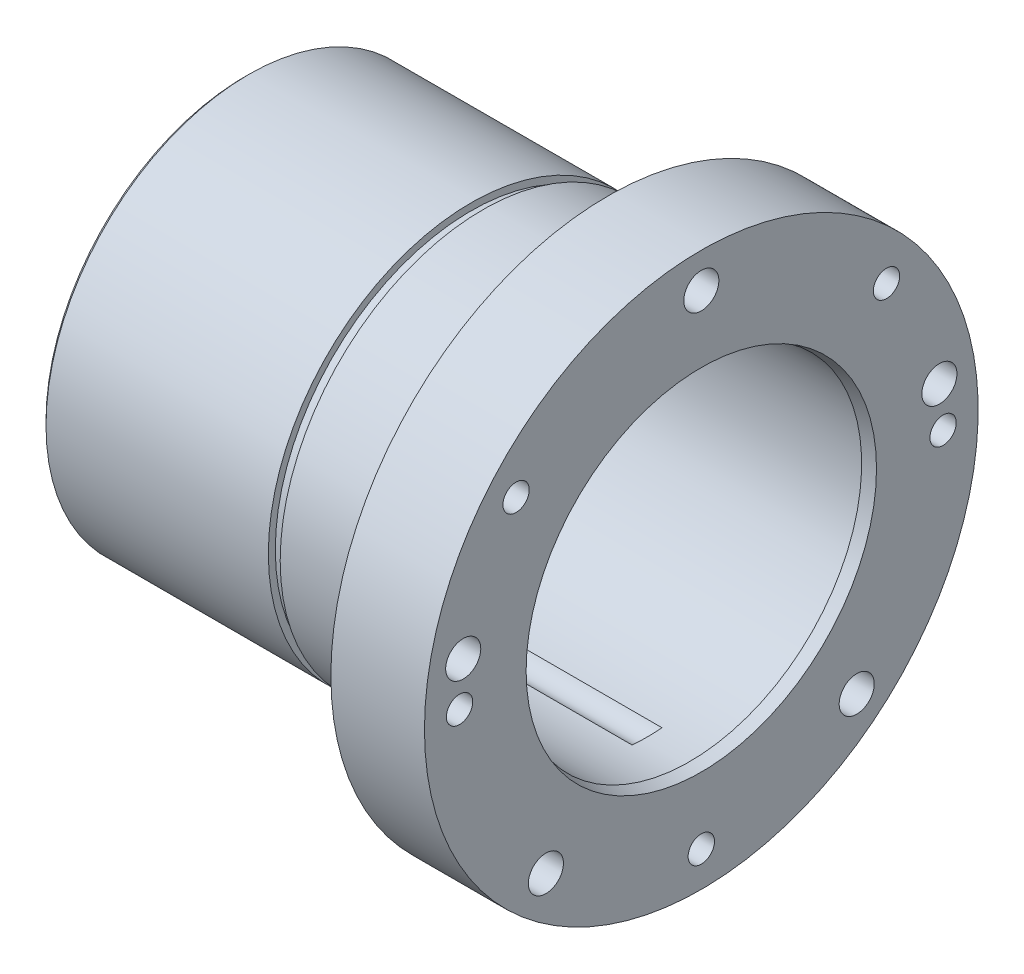
ISO-10303-21;
HEADER;
FILE_DESCRIPTION(('STEP AP214'),'2;1');
FILE_NAME('part.step','',(''),(''),'','','');
FILE_SCHEMA(('AUTOMOTIVE_DESIGN { 1 0 10303 214 1 1 1 1 }'));
ENDSEC;
DATA;
#1=APPLICATION_CONTEXT('core data for automotive mechanical design processes');
#2=APPLICATION_PROTOCOL_DEFINITION('international standard','automotive_design',2000,#1);
#3=PRODUCT_CONTEXT('',#1,'mechanical');
#4=PRODUCT('Part','Part','',(#3));
#5=PRODUCT_RELATED_PRODUCT_CATEGORY('part','',(#4));
#6=PRODUCT_DEFINITION_FORMATION('','',#4);
#7=PRODUCT_DEFINITION_CONTEXT('part definition',#1,'design');
#8=PRODUCT_DEFINITION('design','',#6,#7);
#9=PRODUCT_DEFINITION_SHAPE('','',#8);
#10=(LENGTH_UNIT() NAMED_UNIT(*) SI_UNIT(.MILLI.,.METRE.));
#11=(NAMED_UNIT(*) PLANE_ANGLE_UNIT() SI_UNIT($,.RADIAN.));
#12=(NAMED_UNIT(*) SI_UNIT($,.STERADIAN.) SOLID_ANGLE_UNIT());
#13=UNCERTAINTY_MEASURE_WITH_UNIT(LENGTH_MEASURE(1.E-05),#10,'distance_accuracy_value','');
#14=(GEOMETRIC_REPRESENTATION_CONTEXT(3) GLOBAL_UNCERTAINTY_ASSIGNED_CONTEXT((#13)) GLOBAL_UNIT_ASSIGNED_CONTEXT((#10,
#11,#12)) REPRESENTATION_CONTEXT('',''));
#15=CARTESIAN_POINT('',(0.,0.,0.));
#16=DIRECTION('',(0.,0.,1.));
#17=DIRECTION('',(1.,0.,0.));
#18=AXIS2_PLACEMENT_3D('',#15,#16,#17);
#19=CARTESIAN_POINT('',(0.,0.,0.));
#20=DIRECTION('',(-1.,0.,0.));
#21=DIRECTION('',(0.,0.,1.));
#22=AXIS2_PLACEMENT_3D('',#19,#20,#21);
#23=CYLINDRICAL_SURFACE('',#22,65.0875);
#24=CARTESIAN_POINT('',(19.05,0.,0.));
#25=DIRECTION('',(-1.,0.,0.));
#26=DIRECTION('',(0.,0.,1.));
#27=AXIS2_PLACEMENT_3D('',#24,#25,#26);
#28=CIRCLE('',#27,65.0875);
#29=CARTESIAN_POINT('',(19.05,-64.7128557943521,6.97344614874062));
#30=VERTEX_POINT('',#29);
#31=CARTESIAN_POINT('',(19.05,-64.7128557943521,-6.9734461487406));
#32=VERTEX_POINT('',#31);
#33=EDGE_CURVE('E101',#30,#32,#28,.T.);
#34=ORIENTED_EDGE('',*,*,#33,.F.);
#35=DIRECTION('',(-1.,0.,0.));
#36=VECTOR('',#35,1.);
#37=CARTESIAN_POINT('',(81.8642,-64.7128557943521,6.97344614874068));
#38=LINE('',#37,#36);
#39=CARTESIAN_POINT('',(0.,-64.7128557943521,6.97344614874068));
#40=VERTEX_POINT('',#39);
#41=EDGE_CURVE('E59',#30,#40,#38,.T.);
#42=ORIENTED_EDGE('',*,*,#41,.T.);
#43=CARTESIAN_POINT('',(0.,0.,0.));
#44=DIRECTION('',(-1.,0.,0.));
#45=DIRECTION('',(0.,0.,1.));
#46=AXIS2_PLACEMENT_3D('',#43,#44,#45);
#47=CIRCLE('',#46,65.0875);
#48=CARTESIAN_POINT('',(0.,-64.7128557943521,-6.97344614874067));
#49=VERTEX_POINT('',#48);
#50=EDGE_CURVE('E129',#40,#49,#47,.T.);
#51=ORIENTED_EDGE('',*,*,#50,.T.);
#52=DIRECTION('',(-1.,0.,0.));
#53=VECTOR('',#52,1.);
#54=CARTESIAN_POINT('',(81.8642,-64.7128557943521,-6.97344614874067));
#55=LINE('',#54,#53);
#56=EDGE_CURVE('E98',#49,#32,#55,.F.);
#57=ORIENTED_EDGE('',*,*,#56,.T.);
#58=EDGE_LOOP('',(#34,#42,#51,#57));
#59=FACE_BOUND('',#58,.T.);
#60=ADVANCED_FACE('F43',(#59),#23,.F.);
#61=CARTESIAN_POINT('',(0.,65.0875,0.));
#62=DIRECTION('',(1.,0.,0.));
#63=DIRECTION('',(0.,0.,-1.));
#64=AXIS2_PLACEMENT_3D('',#61,#62,#63);
#65=PLANE('',#64);
#66=CARTESIAN_POINT('',(0.,0.,0.));
#67=DIRECTION('',(1.,0.,0.));
#68=DIRECTION('',(0.,0.,-1.));
#69=AXIS2_PLACEMENT_3D('',#66,#67,#68);
#70=CIRCLE('',#69,80.95488);
#71=CARTESIAN_POINT('',(0.,0.,-80.95488));
#72=VERTEX_POINT('',#71);
#73=EDGE_CURVE('E132',#72,#72,#70,.F.);
#74=ORIENTED_EDGE('',*,*,#73,.T.);
#75=EDGE_LOOP('',(#74));
#76=FACE_BOUND('',#75,.T.);
#77=ORIENTED_EDGE('',*,*,#50,.F.);
#78=CARTESIAN_POINT('',(0.,-66.10985,0.));
#79=DIRECTION('',(-1.,0.,0.));
#80=DIRECTION('',(0.,0.,1.));
#81=AXIS2_PLACEMENT_3D('',#78,#79,#80);
#82=CIRCLE('',#81,7.11199999999999);
#83=EDGE_CURVE('E94',#49,#40,#82,.T.);
#84=ORIENTED_EDGE('',*,*,#83,.F.);
#85=EDGE_LOOP('',(#77,#84));
#86=FACE_BOUND('',#85,.T.);
#87=ADVANCED_FACE('F150',(#76,#86),#65,.F.);
#88=CARTESIAN_POINT('',(0.,0.,0.));
#89=DIRECTION('',(-1.,0.,0.));
#90=DIRECTION('',(0.,0.,1.));
#91=AXIS2_PLACEMENT_3D('',#88,#89,#90);
#92=CYLINDRICAL_SURFACE('',#91,82.54238);
#93=CARTESIAN_POINT('',(1.58749999999999,0.,0.));
#94=DIRECTION('',(1.,0.,0.));
#95=DIRECTION('',(0.,0.,-1.));
#96=AXIS2_PLACEMENT_3D('',#93,#94,#95);
#97=CIRCLE('',#96,82.54238);
#98=CARTESIAN_POINT('',(1.58749999999999,0.,-82.54238));
#99=VERTEX_POINT('',#98);
#100=EDGE_CURVE('E135',#99,#99,#97,.T.);
#101=ORIENTED_EDGE('',*,*,#100,.T.);
#102=EDGE_LOOP('',(#101));
#103=FACE_BOUND('',#102,.T.);
#104=CARTESIAN_POINT('',(92.1004,0.,0.));
#105=DIRECTION('',(-1.,0.,0.));
#106=DIRECTION('',(0.,0.,1.));
#107=AXIS2_PLACEMENT_3D('',#104,#105,#106);
#108=CIRCLE('',#107,82.54238);
#109=CARTESIAN_POINT('',(92.1004,0.,82.54238));
#110=VERTEX_POINT('',#109);
#111=EDGE_CURVE('E126',#110,#110,#108,.T.);
#112=ORIENTED_EDGE('',*,*,#111,.T.);
#113=EDGE_LOOP('',(#112));
#114=FACE_BOUND('',#113,.T.);
#115=ADVANCED_FACE('F279',(#103,#114),#92,.T.);
#116=CARTESIAN_POINT('',(92.1004,82.54238,0.));
#117=DIRECTION('',(-1.,0.,0.));
#118=DIRECTION('',(0.,0.,1.));
#119=AXIS2_PLACEMENT_3D('',#116,#117,#118);
#120=PLANE('',#119);
#121=ORIENTED_EDGE('',*,*,#111,.F.);
#122=EDGE_LOOP('',(#121));
#123=FACE_BOUND('',#122,.T.);
#124=CARTESIAN_POINT('',(92.1004,0.,0.));
#125=DIRECTION('',(-1.,0.,0.));
#126=DIRECTION('',(0.,0.,1.));
#127=AXIS2_PLACEMENT_3D('',#124,#125,#126);
#128=CIRCLE('',#127,79.7052);
#129=CARTESIAN_POINT('',(92.1004,0.,79.7052));
#130=VERTEX_POINT('',#129);
#131=EDGE_CURVE('E123',#130,#130,#128,.T.);
#132=ORIENTED_EDGE('',*,*,#131,.T.);
#133=EDGE_LOOP('',(#132));
#134=FACE_BOUND('',#133,.T.);
#135=ADVANCED_FACE('F301',(#123,#134),#120,.F.);
#136=CARTESIAN_POINT('',(0.,0.,0.));
#137=DIRECTION('',(-1.,0.,0.));
#138=DIRECTION('',(0.,0.,1.));
#139=AXIS2_PLACEMENT_3D('',#136,#137,#138);
#140=CYLINDRICAL_SURFACE('',#139,79.7052);
#141=ORIENTED_EDGE('',*,*,#131,.F.);
#142=EDGE_LOOP('',(#141));
#143=FACE_BOUND('',#142,.T.);
#144=CARTESIAN_POINT('',(96.9264,0.,0.));
#145=DIRECTION('',(-1.,0.,0.));
#146=DIRECTION('',(0.,0.,1.));
#147=AXIS2_PLACEMENT_3D('',#144,#145,#146);
#148=CIRCLE('',#147,79.7052);
#149=CARTESIAN_POINT('',(96.9264,0.,79.7052));
#150=VERTEX_POINT('',#149);
#151=EDGE_CURVE('E120',#150,#150,#148,.T.);
#152=ORIENTED_EDGE('',*,*,#151,.T.);
#153=EDGE_LOOP('',(#152));
#154=FACE_BOUND('',#153,.T.);
#155=ADVANCED_FACE('F306',(#143,#154),#140,.T.);
#156=CARTESIAN_POINT('',(96.9264,79.7052,0.));
#157=DIRECTION('',(1.,0.,0.));
#158=DIRECTION('',(0.,0.,-1.));
#159=AXIS2_PLACEMENT_3D('',#156,#157,#158);
#160=PLANE('',#159);
#161=ORIENTED_EDGE('',*,*,#151,.F.);
#162=EDGE_LOOP('',(#161));
#163=FACE_BOUND('',#162,.T.);
#164=CARTESIAN_POINT('',(96.9264,0.,0.));
#165=DIRECTION('',(-1.,0.,0.));
#166=DIRECTION('',(0.,0.,1.));
#167=AXIS2_PLACEMENT_3D('',#164,#165,#166);
#168=CIRCLE('',#167,82.54238);
#169=CARTESIAN_POINT('',(96.9264,0.,82.54238));
#170=VERTEX_POINT('',#169);
#171=EDGE_CURVE('E117',#170,#170,#168,.T.);
#172=ORIENTED_EDGE('',*,*,#171,.T.);
#173=EDGE_LOOP('',(#172));
#174=FACE_BOUND('',#173,.T.);
#175=ADVANCED_FACE('F312',(#163,#174),#160,.F.);
#176=CARTESIAN_POINT('',(0.,0.,0.));
#177=DIRECTION('',(-1.,0.,0.));
#178=DIRECTION('',(0.,0.,1.));
#179=AXIS2_PLACEMENT_3D('',#176,#177,#178);
#180=CYLINDRICAL_SURFACE('',#179,82.54238);
#181=ORIENTED_EDGE('',*,*,#171,.F.);
#182=EDGE_LOOP('',(#181));
#183=FACE_BOUND('',#182,.T.);
#184=CARTESIAN_POINT('',(147.7264,0.,0.));
#185=DIRECTION('',(-1.,0.,0.));
#186=DIRECTION('',(0.,0.,1.));
#187=AXIS2_PLACEMENT_3D('',#184,#185,#186);
#188=CIRCLE('',#187,82.54238);
#189=CARTESIAN_POINT('',(147.7264,0.,82.54238));
#190=VERTEX_POINT('',#189);
#191=EDGE_CURVE('E114',#190,#190,#188,.T.);
#192=ORIENTED_EDGE('',*,*,#191,.T.);
#193=EDGE_LOOP('',(#192));
#194=FACE_BOUND('',#193,.T.);
#195=ADVANCED_FACE('F235',(#183,#194),#180,.T.);
#196=CARTESIAN_POINT('',(147.7264,82.54238,0.));
#197=DIRECTION('',(1.,0.,0.));
#198=DIRECTION('',(0.,0.,-1.));
#199=AXIS2_PLACEMENT_3D('',#196,#197,#198);
#200=PLANE('',#199);
#201=CARTESIAN_POINT('',(147.7264,-9.87446169802609E-11,-98.4250000000552));
#202=DIRECTION('',(-1.,0.,0.));
#203=DIRECTION('',(0.,0.,1.));
#204=AXIS2_PLACEMENT_3D('',#201,#202,#203);
#205=CIRCLE('',#204,5.99313);
#206=CARTESIAN_POINT('',(147.7264,-9.87446169802609E-11,-92.4318700000552));
#207=VERTEX_POINT('',#206);
#208=EDGE_CURVE('E225',#207,#207,#205,.T.);
#209=ORIENTED_EDGE('',*,*,#208,.F.);
#210=EDGE_LOOP('',(#209));
#211=FACE_BOUND('',#210,.T.);
#212=CARTESIAN_POINT('',(147.7264,63.2663704833576,-75.3979243140911));
#213=DIRECTION('',(-1.,0.,0.));
#214=DIRECTION('',(0.,0.,1.));
#215=AXIS2_PLACEMENT_3D('',#212,#213,#214);
#216=CIRCLE('',#215,5.99313);
#217=CARTESIAN_POINT('',(147.7264,63.2663704833576,-69.4047943140911));
#218=VERTEX_POINT('',#217);
#219=EDGE_CURVE('E216',#218,#218,#216,.T.);
#220=ORIENTED_EDGE('',*,*,#219,.F.);
#221=EDGE_LOOP('',(#220));
#222=FACE_BOUND('',#221,.T.);
#223=CARTESIAN_POINT('',(147.7264,63.2663704835084,75.3979243139646));
#224=DIRECTION('',(-1.,0.,0.));
#225=DIRECTION('',(0.,0.,1.));
#226=AXIS2_PLACEMENT_3D('',#223,#224,#225);
#227=CIRCLE('',#226,5.99313);
#228=CARTESIAN_POINT('',(147.7264,63.2663704835084,81.3910543139646));
#229=VERTEX_POINT('',#228);
#230=EDGE_CURVE('E207',#229,#229,#227,.T.);
#231=ORIENTED_EDGE('',*,*,#230,.F.);
#232=EDGE_LOOP('',(#231));
#233=FACE_BOUND('',#232,.T.);
#234=CARTESIAN_POINT('',(147.7264,9.80573188787092E-11,98.4250000000552));
#235=DIRECTION('',(-1.,0.,0.));
#236=DIRECTION('',(0.,0.,1.));
#237=AXIS2_PLACEMENT_3D('',#234,#235,#236);
#238=CIRCLE('',#237,5.99313);
#239=CARTESIAN_POINT('',(147.7264,9.80573188787092E-11,104.418130000055));
#240=VERTEX_POINT('',#239);
#241=EDGE_CURVE('E198',#240,#240,#238,.T.);
#242=ORIENTED_EDGE('',*,*,#241,.F.);
#243=EDGE_LOOP('',(#242));
#244=FACE_BOUND('',#243,.T.);
#245=CARTESIAN_POINT('',(147.7264,-98.4250000000552,9.77136698279334E-11));
#246=DIRECTION('',(-1.,0.,0.));
#247=DIRECTION('',(0.,0.,1.));
#248=AXIS2_PLACEMENT_3D('',#245,#246,#247);
#249=CIRCLE('',#248,5.99313);
#250=CARTESIAN_POINT('',(147.7264,-98.4250000000552,5.99313000009771));
#251=VERTEX_POINT('',#250);
#252=EDGE_CURVE('E189',#251,#251,#249,.T.);
#253=ORIENTED_EDGE('',*,*,#252,.F.);
#254=EDGE_LOOP('',(#253));
#255=FACE_BOUND('',#254,.T.);
#256=CARTESIAN_POINT('',(147.7264,17.0913218868673,-96.9297030902266));
#257=DIRECTION('',(-1.,0.,0.));
#258=DIRECTION('',(0.,0.984807753012209,0.173648177666927));
#259=AXIS2_PLACEMENT_3D('',#256,#257,#258);
#260=CIRCLE('',#259,7.14375);
#261=CARTESIAN_POINT('',(147.7264,24.1265422724483,-95.6892039210185));
#262=VERTEX_POINT('',#261);
#263=EDGE_CURVE('E179',#262,#262,#260,.T.);
#264=ORIENTED_EDGE('',*,*,#263,.F.);
#265=EDGE_LOOP('',(#264));
#266=FACE_BOUND('',#265,.T.);
#267=CARTESIAN_POINT('',(147.7264,-75.3979243139857,-63.2663704833973));
#268=DIRECTION('',(-1.,0.,0.));
#269=DIRECTION('',(0.,0.642787609686535,-0.766044443118981));
#270=AXIS2_PLACEMENT_3D('',#267,#268,#269);
#271=CIRCLE('',#270,7.14375);
#272=CARTESIAN_POINT('',(147.7264,-70.8060103272876,-68.7388004739285));
#273=VERTEX_POINT('',#272);
#274=EDGE_CURVE('E173',#273,#273,#271,.T.);
#275=ORIENTED_EDGE('',*,*,#274,.F.);
#276=EDGE_LOOP('',(#275));
#277=FACE_BOUND('',#276,.T.);
#278=CARTESIAN_POINT('',(147.7264,-75.3979243139849,63.2663704833983));
#279=DIRECTION('',(-1.,0.,0.));
#280=DIRECTION('',(0.,-0.642787609686546,-0.766044443118973));
#281=AXIS2_PLACEMENT_3D('',#278,#279,#280);
#282=CIRCLE('',#281,7.14375);
#283=CARTESIAN_POINT('',(147.7264,-79.9898383006831,57.7939404928671));
#284=VERTEX_POINT('',#283);
#285=EDGE_CURVE('E167',#284,#284,#282,.T.);
#286=ORIENTED_EDGE('',*,*,#285,.F.);
#287=EDGE_LOOP('',(#286));
#288=FACE_BOUND('',#287,.T.);
#289=CARTESIAN_POINT('',(147.7264,17.0913218868686,96.9297030902264));
#290=DIRECTION('',(-1.,0.,0.));
#291=DIRECTION('',(0.,-0.984807753012206,0.17364817766694));
#292=AXIS2_PLACEMENT_3D('',#289,#290,#291);
#293=CIRCLE('',#292,7.14375);
#294=CARTESIAN_POINT('',(147.7264,10.0561015012877,98.1702022594346));
#295=VERTEX_POINT('',#294);
#296=EDGE_CURVE('E160',#295,#295,#293,.T.);
#297=ORIENTED_EDGE('',*,*,#296,.F.);
#298=EDGE_LOOP('',(#297));
#299=FACE_BOUND('',#298,.T.);
#300=CARTESIAN_POINT('',(147.7264,98.425,0.));
#301=DIRECTION('',(-1.,0.,0.));
#302=DIRECTION('',(0.,0.,1.));
#303=AXIS2_PLACEMENT_3D('',#300,#301,#302);
#304=CIRCLE('',#303,7.14375);
#305=CARTESIAN_POINT('',(147.7264,98.425,7.14375));
#306=VERTEX_POINT('',#305);
#307=EDGE_CURVE('E154',#306,#306,#304,.T.);
#308=ORIENTED_EDGE('',*,*,#307,.F.);
#309=EDGE_LOOP('',(#308));
#310=FACE_BOUND('',#309,.T.);
#311=ORIENTED_EDGE('',*,*,#191,.F.);
#312=EDGE_LOOP('',(#311));
#313=FACE_BOUND('',#312,.T.);
#314=CARTESIAN_POINT('',(147.7264,0.,0.));
#315=DIRECTION('',(-1.,0.,0.));
#316=DIRECTION('',(0.,0.,1.));
#317=AXIS2_PLACEMENT_3D('',#314,#315,#316);
#318=CIRCLE('',#317,112.7125);
#319=CARTESIAN_POINT('',(147.7264,0.,112.7125));
#320=VERTEX_POINT('',#319);
#321=EDGE_CURVE('E111',#320,#320,#318,.T.);
#322=ORIENTED_EDGE('',*,*,#321,.T.);
#323=EDGE_LOOP('',(#322));
#324=FACE_BOUND('',#323,.T.);
#325=ADVANCED_FACE('F231',(#211,#222,#233,#244,#255,#266,#277,#288,#299,#310,#313,#324),#200,.F.);
#326=CARTESIAN_POINT('',(0.,0.,0.));
#327=DIRECTION('',(-1.,0.,0.));
#328=DIRECTION('',(0.,0.,1.));
#329=AXIS2_PLACEMENT_3D('',#326,#327,#328);
#330=CYLINDRICAL_SURFACE('',#329,112.7125);
#331=ORIENTED_EDGE('',*,*,#321,.F.);
#332=EDGE_LOOP('',(#331));
#333=FACE_BOUND('',#332,.T.);
#334=CARTESIAN_POINT('',(185.8264,0.,0.));
#335=DIRECTION('',(-1.,0.,0.));
#336=DIRECTION('',(0.,0.,1.));
#337=AXIS2_PLACEMENT_3D('',#334,#335,#336);
#338=CIRCLE('',#337,112.7125);
#339=CARTESIAN_POINT('',(185.8264,0.,112.7125));
#340=VERTEX_POINT('',#339);
#341=EDGE_CURVE('E108',#340,#340,#338,.T.);
#342=ORIENTED_EDGE('',*,*,#341,.T.);
#343=EDGE_LOOP('',(#342));
#344=FACE_BOUND('',#343,.T.);
#345=ADVANCED_FACE('F234',(#333,#344),#330,.T.);
#346=CARTESIAN_POINT('',(185.8264,112.7125,0.));
#347=DIRECTION('',(-1.,0.,0.));
#348=DIRECTION('',(0.,0.,1.));
#349=AXIS2_PLACEMENT_3D('',#346,#347,#348);
#350=PLANE('',#349);
#351=CARTESIAN_POINT('',(185.8264,-9.87446169802609E-11,-98.4250000000552));
#352=DIRECTION('',(-1.,0.,0.));
#353=DIRECTION('',(0.,0.,1.));
#354=AXIS2_PLACEMENT_3D('',#351,#352,#353);
#355=CIRCLE('',#354,5.35812999999998);
#356=CARTESIAN_POINT('',(185.8264,-9.87446169802609E-11,-93.0668700000553));
#357=VERTEX_POINT('',#356);
#358=EDGE_CURVE('E219',#357,#357,#355,.T.);
#359=ORIENTED_EDGE('',*,*,#358,.T.);
#360=EDGE_LOOP('',(#359));
#361=FACE_BOUND('',#360,.T.);
#362=CARTESIAN_POINT('',(185.8264,63.2663704833576,-75.3979243140911));
#363=DIRECTION('',(-1.,0.,0.));
#364=DIRECTION('',(0.,0.,1.));
#365=AXIS2_PLACEMENT_3D('',#362,#363,#364);
#366=CIRCLE('',#365,5.35812999999999);
#367=CARTESIAN_POINT('',(185.8264,63.2663704833576,-70.0397943140911));
#368=VERTEX_POINT('',#367);
#369=EDGE_CURVE('E210',#368,#368,#366,.T.);
#370=ORIENTED_EDGE('',*,*,#369,.T.);
#371=EDGE_LOOP('',(#370));
#372=FACE_BOUND('',#371,.T.);
#373=CARTESIAN_POINT('',(185.8264,63.2663704835084,75.3979243139646));
#374=DIRECTION('',(-1.,0.,0.));
#375=DIRECTION('',(0.,0.,1.));
#376=AXIS2_PLACEMENT_3D('',#373,#374,#375);
#377=CIRCLE('',#376,5.35812999999999);
#378=CARTESIAN_POINT('',(185.8264,63.2663704835084,80.7560543139646));
#379=VERTEX_POINT('',#378);
#380=EDGE_CURVE('E201',#379,#379,#377,.T.);
#381=ORIENTED_EDGE('',*,*,#380,.T.);
#382=EDGE_LOOP('',(#381));
#383=FACE_BOUND('',#382,.T.);
#384=CARTESIAN_POINT('',(185.8264,9.80573188787092E-11,98.4250000000552));
#385=DIRECTION('',(-1.,0.,0.));
#386=DIRECTION('',(0.,0.,1.));
#387=AXIS2_PLACEMENT_3D('',#384,#385,#386);
#388=CIRCLE('',#387,5.35812999999998);
#389=CARTESIAN_POINT('',(185.8264,9.80573188787092E-11,103.783130000055));
#390=VERTEX_POINT('',#389);
#391=EDGE_CURVE('E192',#390,#390,#388,.T.);
#392=ORIENTED_EDGE('',*,*,#391,.T.);
#393=EDGE_LOOP('',(#392));
#394=FACE_BOUND('',#393,.T.);
#395=CARTESIAN_POINT('',(185.8264,-98.4250000000552,9.77136698279334E-11));
#396=DIRECTION('',(-1.,0.,0.));
#397=DIRECTION('',(0.,0.,1.));
#398=AXIS2_PLACEMENT_3D('',#395,#396,#397);
#399=CIRCLE('',#398,5.35812999999999);
#400=CARTESIAN_POINT('',(185.8264,-98.4250000000552,5.3581300000977));
#401=VERTEX_POINT('',#400);
#402=EDGE_CURVE('E164',#401,#401,#399,.T.);
#403=ORIENTED_EDGE('',*,*,#402,.T.);
#404=EDGE_LOOP('',(#403));
#405=FACE_BOUND('',#404,.T.);
#406=CARTESIAN_POINT('',(185.8264,17.0913218868673,-96.9297030902266));
#407=DIRECTION('',(-1.,0.,0.));
#408=DIRECTION('',(0.,0.984807753012209,0.173648177666927));
#409=AXIS2_PLACEMENT_3D('',#406,#407,#408);
#410=CIRCLE('',#409,7.14375);
#411=CARTESIAN_POINT('',(185.8264,24.1265422724483,-95.6892039210185));
#412=VERTEX_POINT('',#411);
#413=EDGE_CURVE('E158',#412,#412,#410,.T.);
#414=ORIENTED_EDGE('',*,*,#413,.T.);
#415=EDGE_LOOP('',(#414));
#416=FACE_BOUND('',#415,.T.);
#417=CARTESIAN_POINT('',(185.8264,-75.3979243139857,-63.2663704833973));
#418=DIRECTION('',(-1.,0.,0.));
#419=DIRECTION('',(0.,0.642787609686535,-0.766044443118981));
#420=AXIS2_PLACEMENT_3D('',#417,#418,#419);
#421=CIRCLE('',#420,7.14375);
#422=CARTESIAN_POINT('',(185.8264,-70.8060103272876,-68.7388004739285));
#423=VERTEX_POINT('',#422);
#424=EDGE_CURVE('E176',#423,#423,#421,.T.);
#425=ORIENTED_EDGE('',*,*,#424,.T.);
#426=EDGE_LOOP('',(#425));
#427=FACE_BOUND('',#426,.T.);
#428=CARTESIAN_POINT('',(185.8264,-75.3979243139849,63.2663704833983));
#429=DIRECTION('',(-1.,0.,0.));
#430=DIRECTION('',(0.,-0.642787609686546,-0.766044443118973));
#431=AXIS2_PLACEMENT_3D('',#428,#429,#430);
#432=CIRCLE('',#431,7.14375);
#433=CARTESIAN_POINT('',(185.8264,-79.9898383006831,57.7939404928671));
#434=VERTEX_POINT('',#433);
#435=EDGE_CURVE('E170',#434,#434,#432,.T.);
#436=ORIENTED_EDGE('',*,*,#435,.T.);
#437=EDGE_LOOP('',(#436));
#438=FACE_BOUND('',#437,.T.);
#439=CARTESIAN_POINT('',(185.8264,17.0913218868686,96.9297030902264));
#440=DIRECTION('',(-1.,0.,0.));
#441=DIRECTION('',(0.,-0.984807753012206,0.17364817766694));
#442=AXIS2_PLACEMENT_3D('',#439,#440,#441);
#443=CIRCLE('',#442,7.14375);
#444=CARTESIAN_POINT('',(185.8264,10.0561015012877,98.1702022594346));
#445=VERTEX_POINT('',#444);
#446=EDGE_CURVE('E163',#445,#445,#443,.T.);
#447=ORIENTED_EDGE('',*,*,#446,.T.);
#448=EDGE_LOOP('',(#447));
#449=FACE_BOUND('',#448,.T.);
#450=CARTESIAN_POINT('',(185.8264,98.425,0.));
#451=DIRECTION('',(-1.,0.,0.));
#452=DIRECTION('',(0.,0.,1.));
#453=AXIS2_PLACEMENT_3D('',#450,#451,#452);
#454=CIRCLE('',#453,7.14375);
#455=CARTESIAN_POINT('',(185.8264,98.425,7.14375));
#456=VERTEX_POINT('',#455);
#457=EDGE_CURVE('E151',#456,#456,#454,.T.);
#458=ORIENTED_EDGE('',*,*,#457,.T.);
#459=EDGE_LOOP('',(#458));
#460=FACE_BOUND('',#459,.T.);
#461=CARTESIAN_POINT('',(185.8264,0.,0.));
#462=DIRECTION('',(-1.,0.,0.));
#463=DIRECTION('',(0.,0.,1.));
#464=AXIS2_PLACEMENT_3D('',#461,#462,#463);
#465=CIRCLE('',#464,71.326360983697);
#466=CARTESIAN_POINT('',(185.8264,0.,71.326360983697));
#467=VERTEX_POINT('',#466);
#468=EDGE_CURVE('E138',#467,#467,#465,.T.);
#469=ORIENTED_EDGE('',*,*,#468,.T.);
#470=EDGE_LOOP('',(#469));
#471=FACE_BOUND('',#470,.T.);
#472=ORIENTED_EDGE('',*,*,#341,.F.);
#473=EDGE_LOOP('',(#472));
#474=FACE_BOUND('',#473,.T.);
#475=ADVANCED_FACE('F261',(#361,#372,#383,#394,#405,#416,#427,#438,#449,#460,#471,#474),#350,.F.);
#476=CARTESIAN_POINT('',(0.,0.,0.));
#477=DIRECTION('',(-1.,0.,0.));
#478=DIRECTION('',(0.,0.,1.));
#479=AXIS2_PLACEMENT_3D('',#476,#477,#478);
#480=CYLINDRICAL_SURFACE('',#479,70.04685);
#481=CARTESIAN_POINT('',(181.0512,0.,0.));
#482=DIRECTION('',(-1.,0.,0.));
#483=DIRECTION('',(0.,0.,1.));
#484=AXIS2_PLACEMENT_3D('',#481,#482,#483);
#485=CIRCLE('',#484,70.04685);
#486=CARTESIAN_POINT('',(181.0512,0.,70.04685));
#487=VERTEX_POINT('',#486);
#488=EDGE_CURVE('E141',#487,#487,#485,.F.);
#489=ORIENTED_EDGE('',*,*,#488,.T.);
#490=EDGE_LOOP('',(#489));
#491=FACE_BOUND('',#490,.T.);
#492=CARTESIAN_POINT('',(163.7284,0.,0.));
#493=DIRECTION('',(-1.,0.,0.));
#494=DIRECTION('',(0.,0.,1.));
#495=AXIS2_PLACEMENT_3D('',#492,#493,#494);
#496=CIRCLE('',#495,70.04685);
#497=CARTESIAN_POINT('',(163.7284,-69.7815296657381,6.09092049137115));
#498=VERTEX_POINT('',#497);
#499=CARTESIAN_POINT('',(163.7284,-69.7815296657381,-6.09092049137113));
#500=VERTEX_POINT('',#499);
#501=EDGE_CURVE('E12',#498,#500,#496,.F.);
#502=ORIENTED_EDGE('',*,*,#501,.F.);
#503=DIRECTION('',(-1.,0.,0.));
#504=VECTOR('',#503,1.);
#505=CARTESIAN_POINT('',(81.8642,-69.7815296657381,6.09092049137117));
#506=LINE('',#505,#504);
#507=CARTESIAN_POINT('',(19.05,-69.7815296657381,6.09092049137121));
#508=VERTEX_POINT('',#507);
#509=EDGE_CURVE('E82',#498,#508,#506,.T.);
#510=ORIENTED_EDGE('',*,*,#509,.T.);
#511=CARTESIAN_POINT('',(19.05,0.,0.));
#512=DIRECTION('',(-1.,0.,0.));
#513=DIRECTION('',(0.,0.,1.));
#514=AXIS2_PLACEMENT_3D('',#511,#512,#513);
#515=CIRCLE('',#514,70.04685);
#516=CARTESIAN_POINT('',(19.05,-69.7815296657381,-6.09092049137119));
#517=VERTEX_POINT('',#516);
#518=EDGE_CURVE('E97',#508,#517,#515,.T.);
#519=ORIENTED_EDGE('',*,*,#518,.T.);
#520=DIRECTION('',(-1.,0.,0.));
#521=VECTOR('',#520,1.);
#522=CARTESIAN_POINT('',(81.8642,-69.7815296657381,-6.09092049137115));
#523=LINE('',#522,#521);
#524=EDGE_CURVE('E66',#517,#500,#523,.F.);
#525=ORIENTED_EDGE('',*,*,#524,.T.);
#526=EDGE_LOOP('',(#502,#510,#519,#525));
#527=FACE_BOUND('',#526,.T.);
#528=ADVANCED_FACE('F96',(#491,#527),#480,.F.);
#529=CARTESIAN_POINT('',(19.05,70.04685,0.));
#530=DIRECTION('',(-1.,0.,0.));
#531=DIRECTION('',(0.,0.,1.));
#532=AXIS2_PLACEMENT_3D('',#529,#530,#531);
#533=PLANE('',#532);
#534=ORIENTED_EDGE('',*,*,#33,.T.);
#535=CARTESIAN_POINT('',(19.05,-66.10985,0.));
#536=DIRECTION('',(-1.,0.,0.));
#537=DIRECTION('',(0.,0.,1.));
#538=AXIS2_PLACEMENT_3D('',#535,#536,#537);
#539=CIRCLE('',#538,7.11199999999999);
#540=EDGE_CURVE('E52',#32,#517,#539,.T.);
#541=ORIENTED_EDGE('',*,*,#540,.T.);
#542=ORIENTED_EDGE('',*,*,#518,.F.);
#543=EDGE_CURVE('E86',#508,#30,#539,.T.);
#544=ORIENTED_EDGE('',*,*,#543,.T.);
#545=EDGE_LOOP('',(#534,#541,#542,#544));
#546=FACE_BOUND('',#545,.T.);
#547=ADVANCED_FACE('F145',(#546),#533,.F.);
#548=CARTESIAN_POINT('',(0.,0.,0.));
#549=DIRECTION('',(1.,0.,0.));
#550=DIRECTION('',(0.,0.,-1.));
#551=AXIS2_PLACEMENT_3D('',#548,#549,#550);
#552=CONICAL_SURFACE('',#551,80.95488,0.785398163397448);
#553=ORIENTED_EDGE('',*,*,#100,.F.);
#554=EDGE_LOOP('',(#553));
#555=FACE_BOUND('',#554,.T.);
#556=ORIENTED_EDGE('',*,*,#73,.F.);
#557=EDGE_LOOP('',(#556));
#558=FACE_BOUND('',#557,.T.);
#559=ADVANCED_FACE('F284',(#555,#558),#552,.T.);
#560=CARTESIAN_POINT('',(185.8264,0.,0.));
#561=DIRECTION('',(1.,0.,0.));
#562=DIRECTION('',(0.,0.,-1.));
#563=AXIS2_PLACEMENT_3D('',#560,#561,#562);
#564=CONICAL_SURFACE('',#563,71.326360983697,0.261799387799145);
#565=ORIENTED_EDGE('',*,*,#488,.F.);
#566=EDGE_LOOP('',(#565));
#567=FACE_BOUND('',#566,.T.);
#568=ORIENTED_EDGE('',*,*,#468,.F.);
#569=EDGE_LOOP('',(#568));
#570=FACE_BOUND('',#569,.T.);
#571=ADVANCED_FACE('F46',(#567,#570),#564,.F.);
#572=CARTESIAN_POINT('',(163.7284,112.7125,0.));
#573=DIRECTION('',(-1.,0.,0.));
#574=DIRECTION('',(0.,0.,1.));
#575=AXIS2_PLACEMENT_3D('',#572,#573,#574);
#576=PLANE('',#575);
#577=ORIENTED_EDGE('',*,*,#501,.T.);
#578=CARTESIAN_POINT('',(163.7284,-66.10985,0.));
#579=DIRECTION('',(-1.,0.,0.));
#580=DIRECTION('',(0.,0.,1.));
#581=AXIS2_PLACEMENT_3D('',#578,#579,#580);
#582=CIRCLE('',#581,7.11199999999999);
#583=EDGE_CURVE('E85',#498,#500,#582,.F.);
#584=ORIENTED_EDGE('',*,*,#583,.F.);
#585=EDGE_LOOP('',(#577,#584));
#586=FACE_BOUND('',#585,.T.);
#587=ADVANCED_FACE('F93',(#586),#576,.T.);
#588=CARTESIAN_POINT('',(205.942173711195,-66.10985,0.));
#589=DIRECTION('',(-1.,0.,0.));
#590=DIRECTION('',(0.,0.,1.));
#591=AXIS2_PLACEMENT_3D('',#588,#589,#590);
#592=CYLINDRICAL_SURFACE('',#591,7.11199999999999);
#593=ORIENTED_EDGE('',*,*,#83,.T.);
#594=ORIENTED_EDGE('',*,*,#41,.F.);
#595=ORIENTED_EDGE('',*,*,#543,.F.);
#596=ORIENTED_EDGE('',*,*,#509,.F.);
#597=ORIENTED_EDGE('',*,*,#583,.T.);
#598=ORIENTED_EDGE('',*,*,#524,.F.);
#599=ORIENTED_EDGE('',*,*,#540,.F.);
#600=ORIENTED_EDGE('',*,*,#56,.F.);
#601=EDGE_LOOP('',(#593,#594,#595,#596,#597,#598,#599,#600));
#602=FACE_BOUND('',#601,.T.);
#603=ADVANCED_FACE('F84',(#602),#592,.F.);
#604=CARTESIAN_POINT('',(185.8264,98.425,0.));
#605=DIRECTION('',(-1.,0.,0.));
#606=DIRECTION('',(0.,0.,1.));
#607=AXIS2_PLACEMENT_3D('',#604,#605,#606);
#608=CYLINDRICAL_SURFACE('',#607,7.14375);
#609=ORIENTED_EDGE('',*,*,#457,.F.);
#610=EDGE_LOOP('',(#609));
#611=FACE_BOUND('',#610,.T.);
#612=ORIENTED_EDGE('',*,*,#307,.T.);
#613=EDGE_LOOP('',(#612));
#614=FACE_BOUND('',#613,.T.);
#615=ADVANCED_FACE('F394',(#611,#614),#608,.F.);
#616=CARTESIAN_POINT('',(185.8264,17.0913218868686,96.9297030902264));
#617=DIRECTION('',(-1.,0.,0.));
#618=DIRECTION('',(0.,0.,1.));
#619=AXIS2_PLACEMENT_3D('',#616,#617,#618);
#620=CYLINDRICAL_SURFACE('',#619,7.14375);
#621=ORIENTED_EDGE('',*,*,#446,.F.);
#622=EDGE_LOOP('',(#621));
#623=FACE_BOUND('',#622,.T.);
#624=ORIENTED_EDGE('',*,*,#296,.T.);
#625=EDGE_LOOP('',(#624));
#626=FACE_BOUND('',#625,.T.);
#627=ADVANCED_FACE('F403',(#623,#626),#620,.F.);
#628=CARTESIAN_POINT('',(185.8264,-75.3979243139849,63.2663704833983));
#629=DIRECTION('',(-1.,0.,0.));
#630=DIRECTION('',(0.,0.,1.));
#631=AXIS2_PLACEMENT_3D('',#628,#629,#630);
#632=CYLINDRICAL_SURFACE('',#631,7.14375);
#633=ORIENTED_EDGE('',*,*,#435,.F.);
#634=EDGE_LOOP('',(#633));
#635=FACE_BOUND('',#634,.T.);
#636=ORIENTED_EDGE('',*,*,#285,.T.);
#637=EDGE_LOOP('',(#636));
#638=FACE_BOUND('',#637,.T.);
#639=ADVANCED_FACE('F413',(#635,#638),#632,.F.);
#640=CARTESIAN_POINT('',(185.8264,-75.3979243139857,-63.2663704833973));
#641=DIRECTION('',(-1.,0.,0.));
#642=DIRECTION('',(0.,0.,1.));
#643=AXIS2_PLACEMENT_3D('',#640,#641,#642);
#644=CYLINDRICAL_SURFACE('',#643,7.14375);
#645=ORIENTED_EDGE('',*,*,#424,.F.);
#646=EDGE_LOOP('',(#645));
#647=FACE_BOUND('',#646,.T.);
#648=ORIENTED_EDGE('',*,*,#274,.T.);
#649=EDGE_LOOP('',(#648));
#650=FACE_BOUND('',#649,.T.);
#651=ADVANCED_FACE('F423',(#647,#650),#644,.F.);
#652=CARTESIAN_POINT('',(185.8264,17.0913218868673,-96.9297030902266));
#653=DIRECTION('',(-1.,0.,0.));
#654=DIRECTION('',(0.,0.,1.));
#655=AXIS2_PLACEMENT_3D('',#652,#653,#654);
#656=CYLINDRICAL_SURFACE('',#655,7.14375);
#657=ORIENTED_EDGE('',*,*,#413,.F.);
#658=EDGE_LOOP('',(#657));
#659=FACE_BOUND('',#658,.T.);
#660=ORIENTED_EDGE('',*,*,#263,.T.);
#661=EDGE_LOOP('',(#660));
#662=FACE_BOUND('',#661,.T.);
#663=ADVANCED_FACE('F433',(#659,#662),#656,.F.);
#664=CARTESIAN_POINT('',(147.7264,-98.4250000000552,9.77136698279334E-11));
#665=DIRECTION('',(-1.,0.,0.));
#666=DIRECTION('',(0.,0.,1.));
#667=AXIS2_PLACEMENT_3D('',#664,#665,#666);
#668=CYLINDRICAL_SURFACE('',#667,5.35812999999999);
#669=ORIENTED_EDGE('',*,*,#402,.F.);
#670=EDGE_LOOP('',(#669));
#671=FACE_BOUND('',#670,.T.);
#672=CARTESIAN_POINT('',(148.259228265798,-98.4250000000552,9.77136698279334E-11));
#673=DIRECTION('',(-1.,0.,0.));
#674=DIRECTION('',(0.,0.,1.));
#675=AXIS2_PLACEMENT_3D('',#672,#673,#674);
#676=CIRCLE('',#675,5.35812999999999);
#677=CARTESIAN_POINT('',(148.259228265798,-98.4250000000552,5.3581300000977));
#678=VERTEX_POINT('',#677);
#679=EDGE_CURVE('E186',#678,#678,#676,.T.);
#680=ORIENTED_EDGE('',*,*,#679,.T.);
#681=EDGE_LOOP('',(#680));
#682=FACE_BOUND('',#681,.T.);
#683=ADVANCED_FACE('F443',(#671,#682),#668,.F.);
#684=CARTESIAN_POINT('',(147.7264,-98.4250000000552,9.77136698279334E-11));
#685=DIRECTION('',(-1.,0.,0.));
#686=DIRECTION('',(0.,0.,1.));
#687=AXIS2_PLACEMENT_3D('',#684,#685,#686);
#688=CONICAL_SURFACE('',#687,5.99313,0.872664625997182);
#689=ORIENTED_EDGE('',*,*,#679,.F.);
#690=EDGE_LOOP('',(#689));
#691=FACE_BOUND('',#690,.T.);
#692=ORIENTED_EDGE('',*,*,#252,.T.);
#693=EDGE_LOOP('',(#692));
#694=FACE_BOUND('',#693,.T.);
#695=ADVANCED_FACE('F452',(#691,#694),#688,.F.);
#696=CARTESIAN_POINT('',(147.7264,9.80573188787092E-11,98.4250000000552));
#697=DIRECTION('',(-1.,0.,0.));
#698=DIRECTION('',(0.,0.,1.));
#699=AXIS2_PLACEMENT_3D('',#696,#697,#698);
#700=CYLINDRICAL_SURFACE('',#699,5.35812999999999);
#701=ORIENTED_EDGE('',*,*,#391,.F.);
#702=EDGE_LOOP('',(#701));
#703=FACE_BOUND('',#702,.T.);
#704=CARTESIAN_POINT('',(148.259228265798,9.80573188787092E-11,98.4250000000552));
#705=DIRECTION('',(-1.,0.,0.));
#706=DIRECTION('',(0.,0.,1.));
#707=AXIS2_PLACEMENT_3D('',#704,#705,#706);
#708=CIRCLE('',#707,5.35813);
#709=CARTESIAN_POINT('',(148.259228265798,9.80573188787092E-11,103.783130000055));
#710=VERTEX_POINT('',#709);
#711=EDGE_CURVE('E195',#710,#710,#708,.T.);
#712=ORIENTED_EDGE('',*,*,#711,.T.);
#713=EDGE_LOOP('',(#712));
#714=FACE_BOUND('',#713,.T.);
#715=ADVANCED_FACE('F461',(#703,#714),#700,.F.);
#716=CARTESIAN_POINT('',(147.7264,9.80573188787092E-11,98.4250000000552));
#717=DIRECTION('',(-1.,0.,0.));
#718=DIRECTION('',(0.,0.,1.));
#719=AXIS2_PLACEMENT_3D('',#716,#717,#718);
#720=CONICAL_SURFACE('',#719,5.99313,0.872664625997176);
#721=ORIENTED_EDGE('',*,*,#711,.F.);
#722=EDGE_LOOP('',(#721));
#723=FACE_BOUND('',#722,.T.);
#724=ORIENTED_EDGE('',*,*,#241,.T.);
#725=EDGE_LOOP('',(#724));
#726=FACE_BOUND('',#725,.T.);
#727=ADVANCED_FACE('F472',(#723,#726),#720,.F.);
#728=CARTESIAN_POINT('',(147.7264,63.2663704835084,75.3979243139646));
#729=DIRECTION('',(-1.,0.,0.));
#730=DIRECTION('',(0.,0.,1.));
#731=AXIS2_PLACEMENT_3D('',#728,#729,#730);
#732=CYLINDRICAL_SURFACE('',#731,5.35812999999999);
#733=ORIENTED_EDGE('',*,*,#380,.F.);
#734=EDGE_LOOP('',(#733));
#735=FACE_BOUND('',#734,.T.);
#736=CARTESIAN_POINT('',(148.259228265798,63.2663704835084,75.3979243139646));
#737=DIRECTION('',(-1.,0.,0.));
#738=DIRECTION('',(0.,0.,1.));
#739=AXIS2_PLACEMENT_3D('',#736,#737,#738);
#740=CIRCLE('',#739,5.35812999999999);
#741=CARTESIAN_POINT('',(148.259228265798,63.2663704835084,80.7560543139646));
#742=VERTEX_POINT('',#741);
#743=EDGE_CURVE('E204',#742,#742,#740,.T.);
#744=ORIENTED_EDGE('',*,*,#743,.T.);
#745=EDGE_LOOP('',(#744));
#746=FACE_BOUND('',#745,.T.);
#747=ADVANCED_FACE('F479',(#735,#746),#732,.F.);
#748=CARTESIAN_POINT('',(147.7264,63.2663704835084,75.3979243139646));
#749=DIRECTION('',(-1.,0.,0.));
#750=DIRECTION('',(0.,0.,1.));
#751=AXIS2_PLACEMENT_3D('',#748,#749,#750);
#752=CONICAL_SURFACE('',#751,5.99313,0.872664625997182);
#753=ORIENTED_EDGE('',*,*,#743,.F.);
#754=EDGE_LOOP('',(#753));
#755=FACE_BOUND('',#754,.T.);
#756=ORIENTED_EDGE('',*,*,#230,.T.);
#757=EDGE_LOOP('',(#756));
#758=FACE_BOUND('',#757,.T.);
#759=ADVANCED_FACE('F487',(#755,#758),#752,.F.);
#760=CARTESIAN_POINT('',(147.7264,63.2663704833576,-75.3979243140911));
#761=DIRECTION('',(-1.,0.,0.));
#762=DIRECTION('',(0.,0.,1.));
#763=AXIS2_PLACEMENT_3D('',#760,#761,#762);
#764=CYLINDRICAL_SURFACE('',#763,5.35813);
#765=ORIENTED_EDGE('',*,*,#369,.F.);
#766=EDGE_LOOP('',(#765));
#767=FACE_BOUND('',#766,.T.);
#768=CARTESIAN_POINT('',(148.259228265798,63.2663704833576,-75.3979243140911));
#769=DIRECTION('',(-1.,0.,0.));
#770=DIRECTION('',(0.,0.,1.));
#771=AXIS2_PLACEMENT_3D('',#768,#769,#770);
#772=CIRCLE('',#771,5.35813);
#773=CARTESIAN_POINT('',(148.259228265798,63.2663704833576,-70.0397943140911));
#774=VERTEX_POINT('',#773);
#775=EDGE_CURVE('E213',#774,#774,#772,.T.);
#776=ORIENTED_EDGE('',*,*,#775,.T.);
#777=EDGE_LOOP('',(#776));
#778=FACE_BOUND('',#777,.T.);
#779=ADVANCED_FACE('F495',(#767,#778),#764,.F.);
#780=CARTESIAN_POINT('',(147.7264,63.2663704833576,-75.3979243140911));
#781=DIRECTION('',(-1.,0.,0.));
#782=DIRECTION('',(0.,0.,1.));
#783=AXIS2_PLACEMENT_3D('',#780,#781,#782);
#784=CONICAL_SURFACE('',#783,5.99313,0.872664625997171);
#785=ORIENTED_EDGE('',*,*,#775,.F.);
#786=EDGE_LOOP('',(#785));
#787=FACE_BOUND('',#786,.T.);
#788=ORIENTED_EDGE('',*,*,#219,.T.);
#789=EDGE_LOOP('',(#788));
#790=FACE_BOUND('',#789,.T.);
#791=ADVANCED_FACE('F503',(#787,#790),#784,.F.);
#792=CARTESIAN_POINT('',(147.7264,-9.87446169802609E-11,-98.4250000000552));
#793=DIRECTION('',(-1.,0.,0.));
#794=DIRECTION('',(0.,0.,1.));
#795=AXIS2_PLACEMENT_3D('',#792,#793,#794);
#796=CYLINDRICAL_SURFACE('',#795,5.35812999999999);
#797=ORIENTED_EDGE('',*,*,#358,.F.);
#798=EDGE_LOOP('',(#797));
#799=FACE_BOUND('',#798,.T.);
#800=CARTESIAN_POINT('',(148.259228265798,-9.87446169802609E-11,-98.4250000000552));
#801=DIRECTION('',(-1.,0.,0.));
#802=DIRECTION('',(0.,0.,1.));
#803=AXIS2_PLACEMENT_3D('',#800,#801,#802);
#804=CIRCLE('',#803,5.35813);
#805=CARTESIAN_POINT('',(148.259228265798,-9.87446169802609E-11,-93.0668700000553));
#806=VERTEX_POINT('',#805);
#807=EDGE_CURVE('E222',#806,#806,#804,.T.);
#808=ORIENTED_EDGE('',*,*,#807,.T.);
#809=EDGE_LOOP('',(#808));
#810=FACE_BOUND('',#809,.T.);
#811=ADVANCED_FACE('F511',(#799,#810),#796,.F.);
#812=CARTESIAN_POINT('',(147.7264,-9.87446169802609E-11,-98.4250000000552));
#813=DIRECTION('',(-1.,0.,0.));
#814=DIRECTION('',(0.,0.,1.));
#815=AXIS2_PLACEMENT_3D('',#812,#813,#814);
#816=CONICAL_SURFACE('',#815,5.99313,0.872664625997176);
#817=ORIENTED_EDGE('',*,*,#807,.F.);
#818=EDGE_LOOP('',(#817));
#819=FACE_BOUND('',#818,.T.);
#820=ORIENTED_EDGE('',*,*,#208,.T.);
#821=EDGE_LOOP('',(#820));
#822=FACE_BOUND('',#821,.T.);
#823=ADVANCED_FACE('F229',(#819,#822),#816,.F.);
#824=CLOSED_SHELL('',(#60,#87,#115,#135,#155,#175,#195,#325,#345,#475,#528,#547,#559,#571,#587,
#603,#615,#627,#639,#651,#663,#683,#695,#715,#727,#747,#759,#779,#791,#811,#823));
#825=MANIFOLD_SOLID_BREP('B2',#824);
#826=ADVANCED_BREP_SHAPE_REPRESENTATION('',(#18,#825),#14);
#827=SHAPE_DEFINITION_REPRESENTATION(#9,#826);
ENDSEC;
END-ISO-10303-21;
